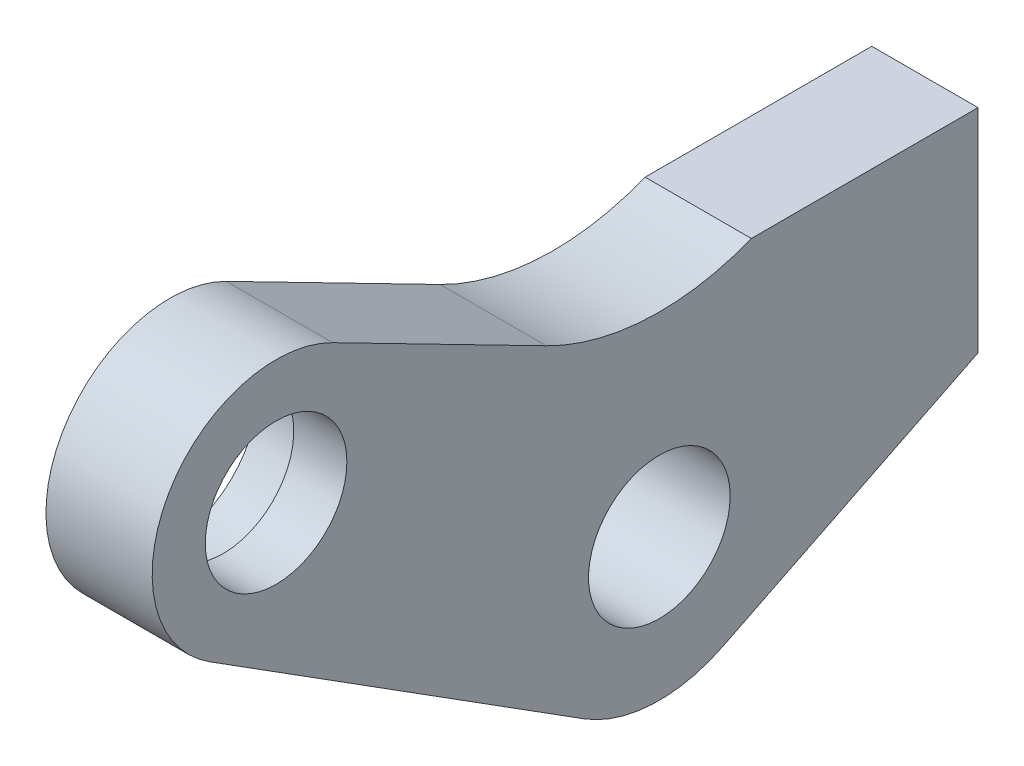
ISO-10303-21;
HEADER;
FILE_DESCRIPTION(('STEP AP214'),'2;1');
FILE_NAME('part.step','',(''),(''),'','','');
FILE_SCHEMA(('AUTOMOTIVE_DESIGN { 1 0 10303 214 1 1 1 1 }'));
ENDSEC;
DATA;
#1=APPLICATION_CONTEXT('core data for automotive mechanical design processes');
#2=APPLICATION_PROTOCOL_DEFINITION('international standard','automotive_design',2000,#1);
#3=PRODUCT_CONTEXT('',#1,'mechanical');
#4=PRODUCT('Part','Part','',(#3));
#5=PRODUCT_RELATED_PRODUCT_CATEGORY('part','',(#4));
#6=PRODUCT_DEFINITION_FORMATION('','',#4);
#7=PRODUCT_DEFINITION_CONTEXT('part definition',#1,'design');
#8=PRODUCT_DEFINITION('design','',#6,#7);
#9=PRODUCT_DEFINITION_SHAPE('','',#8);
#10=(LENGTH_UNIT() NAMED_UNIT(*) SI_UNIT(.MILLI.,.METRE.));
#11=(NAMED_UNIT(*) PLANE_ANGLE_UNIT() SI_UNIT($,.RADIAN.));
#12=(NAMED_UNIT(*) SI_UNIT($,.STERADIAN.) SOLID_ANGLE_UNIT());
#13=UNCERTAINTY_MEASURE_WITH_UNIT(LENGTH_MEASURE(1.E-05),#10,'distance_accuracy_value','');
#14=(GEOMETRIC_REPRESENTATION_CONTEXT(3) GLOBAL_UNCERTAINTY_ASSIGNED_CONTEXT((#13)) GLOBAL_UNIT_ASSIGNED_CONTEXT((#10,
#11,#12)) REPRESENTATION_CONTEXT('',''));
#15=CARTESIAN_POINT('',(0.,0.,0.));
#16=DIRECTION('',(0.,0.,1.));
#17=DIRECTION('',(1.,0.,0.));
#18=AXIS2_PLACEMENT_3D('',#15,#16,#17);
#19=CARTESIAN_POINT('',(6.,42.,51.));
#20=DIRECTION('',(-1.,0.,0.));
#21=DIRECTION('',(0.,0.,1.));
#22=AXIS2_PLACEMENT_3D('',#19,#20,#21);
#23=CYLINDRICAL_SURFACE('',#22,4.00000000000001);
#24=CARTESIAN_POINT('',(6.,42.,51.));
#25=DIRECTION('',(1.,0.,0.));
#26=DIRECTION('',(0.,0.,-1.));
#27=AXIS2_PLACEMENT_3D('',#24,#25,#26);
#28=CIRCLE('',#27,4.00000000000001);
#29=CARTESIAN_POINT('',(6.,42.,47.));
#30=VERTEX_POINT('',#29);
#31=EDGE_CURVE('E136',#30,#30,#28,.T.);
#32=ORIENTED_EDGE('',*,*,#31,.T.);
#33=EDGE_LOOP('',(#32));
#34=FACE_BOUND('',#33,.T.);
#35=CARTESIAN_POINT('',(3.,42.,51.));
#36=DIRECTION('',(-1.,0.,0.));
#37=DIRECTION('',(0.,0.,1.));
#38=AXIS2_PLACEMENT_3D('',#35,#36,#37);
#39=CIRCLE('',#38,4.00000000000001);
#40=CARTESIAN_POINT('',(3.,42.,55.));
#41=VERTEX_POINT('',#40);
#42=EDGE_CURVE('E37',#41,#41,#39,.T.);
#43=ORIENTED_EDGE('',*,*,#42,.T.);
#44=EDGE_LOOP('',(#43));
#45=FACE_BOUND('',#44,.T.);
#46=ADVANCED_FACE('F33',(#34,#45),#23,.F.);
#47=CARTESIAN_POINT('',(6.,42.,51.));
#48=DIRECTION('',(-1.,0.,0.));
#49=DIRECTION('',(0.,0.,1.));
#50=AXIS2_PLACEMENT_3D('',#47,#48,#49);
#51=PLANE('',#50);
#52=ORIENTED_EDGE('',*,*,#31,.F.);
#53=EDGE_LOOP('',(#52));
#54=FACE_BOUND('',#53,.T.);
#55=CARTESIAN_POINT('',(6.,42.,51.));
#56=DIRECTION('',(1.,0.,0.));
#57=DIRECTION('',(0.,0.,1.));
#58=AXIS2_PLACEMENT_3D('',#55,#56,#57);
#59=CIRCLE('',#58,6.99999999999999);
#60=CARTESIAN_POINT('',(6.,48.2292552348518,47.8068230210226));
#61=VERTEX_POINT('',#60);
#62=CARTESIAN_POINT('',(6.,36.0826738572205,54.7396859921627));
#63=VERTEX_POINT('',#62);
#64=EDGE_CURVE('E147',#61,#63,#59,.T.);
#65=ORIENTED_EDGE('',*,*,#64,.T.);
#66=DIRECTION('',(0.,-0.534240856023249,-0.845332306111358));
#67=VECTOR('',#66,1.);
#68=CARTESIAN_POINT('',(6.,36.0826738572205,54.7396859921627));
#69=LINE('',#68,#67);
#70=CARTESIAN_POINT('',(6.,22.7373415511092,33.623291753575));
#71=VERTEX_POINT('',#70);
#72=EDGE_CURVE('E94',#63,#71,#69,.T.);
#73=ORIENTED_EDGE('',*,*,#72,.T.);
#74=CARTESIAN_POINT('',(6.,29.5,29.349364905389));
#75=DIRECTION('',(1.,0.,0.));
#76=DIRECTION('',(0.,0.,-1.));
#77=AXIS2_PLACEMENT_3D('',#74,#75,#76);
#78=CIRCLE('',#77,7.99999999999999);
#79=CARTESIAN_POINT('',(6.,22.3335486681791,25.7938093498335));
#80=VERTEX_POINT('',#79);
#81=EDGE_CURVE('E163',#71,#80,#78,.T.);
#82=ORIENTED_EDGE('',*,*,#81,.T.);
#83=DIRECTION('',(0.,0.444444444444444,-0.895806416477617));
#84=VECTOR('',#83,1.);
#85=CARTESIAN_POINT('',(6.,29.5,11.349364905389));
#86=LINE('',#85,#84);
#87=CARTESIAN_POINT('',(6.,29.5,11.349364905389));
#88=VERTEX_POINT('',#87);
#89=EDGE_CURVE('E176',#80,#88,#86,.T.);
#90=ORIENTED_EDGE('',*,*,#89,.T.);
#91=DIRECTION('',(0.,1.,0.));
#92=VECTOR('',#91,1.);
#93=CARTESIAN_POINT('',(6.,41.5,11.349364905389));
#94=LINE('',#93,#92);
#95=CARTESIAN_POINT('',(6.,41.5,11.349364905389));
#96=VERTEX_POINT('',#95);
#97=EDGE_CURVE('E114',#88,#96,#94,.T.);
#98=ORIENTED_EDGE('',*,*,#97,.T.);
#99=DIRECTION('',(0.,0.,1.));
#100=VECTOR('',#99,1.);
#101=CARTESIAN_POINT('',(6.,41.5,11.349364905389));
#102=LINE('',#101,#100);
#103=CARTESIAN_POINT('',(6.,41.5,24.1532124826824));
#104=VERTEX_POINT('',#103);
#105=EDGE_CURVE('E107',#96,#104,#102,.T.);
#106=ORIENTED_EDGE('',*,*,#105,.T.);
#107=CARTESIAN_POINT('',(6.,54.5,29.349364905389));
#108=DIRECTION('',(-1.,0.,0.));
#109=DIRECTION('',(0.,0.,-1.));
#110=AXIS2_PLACEMENT_3D('',#107,#108,#109);
#111=CIRCLE('',#110,14.);
#112=CARTESIAN_POINT('',(6.,42.0414895302964,35.7357188633439));
#113=VERTEX_POINT('',#112);
#114=EDGE_CURVE('E112',#104,#113,#111,.T.);
#115=ORIENTED_EDGE('',*,*,#114,.T.);
#116=DIRECTION('',(0.,0.456168139853917,0.88989360497883));
#117=VECTOR('',#116,1.);
#118=CARTESIAN_POINT('',(6.,48.2292552348518,47.8068230210226));
#119=LINE('',#118,#117);
#120=EDGE_CURVE('E51',#113,#61,#119,.T.);
#121=ORIENTED_EDGE('',*,*,#120,.T.);
#122=EDGE_LOOP('',(#65,#73,#82,#90,#98,#106,#115,#121));
#123=FACE_BOUND('',#122,.T.);
#124=CARTESIAN_POINT('',(6.,29.5,29.349364905389));
#125=DIRECTION('',(1.,0.,0.));
#126=DIRECTION('',(0.,0.,-1.));
#127=AXIS2_PLACEMENT_3D('',#124,#125,#126);
#128=CIRCLE('',#127,4.);
#129=CARTESIAN_POINT('',(6.,29.5,25.349364905389));
#130=VERTEX_POINT('',#129);
#131=EDGE_CURVE('E184',#130,#130,#128,.T.);
#132=ORIENTED_EDGE('',*,*,#131,.F.);
#133=EDGE_LOOP('',(#132));
#134=FACE_BOUND('',#133,.T.);
#135=ADVANCED_FACE('F109',(#54,#123,#134),#51,.F.);
#136=CARTESIAN_POINT('',(0.,42.,51.));
#137=DIRECTION('',(-1.,0.,0.));
#138=DIRECTION('',(0.,0.,1.));
#139=AXIS2_PLACEMENT_3D('',#136,#137,#138);
#140=PLANE('',#139);
#141=CARTESIAN_POINT('',(0.,42.,51.));
#142=DIRECTION('',(-1.,0.,0.));
#143=DIRECTION('',(0.,0.,1.));
#144=AXIS2_PLACEMENT_3D('',#141,#142,#143);
#145=CIRCLE('',#144,4.99);
#146=CARTESIAN_POINT('',(0.,42.,55.99));
#147=VERTEX_POINT('',#146);
#148=EDGE_CURVE('E190',#147,#147,#145,.T.);
#149=ORIENTED_EDGE('',*,*,#148,.F.);
#150=EDGE_LOOP('',(#149));
#151=FACE_BOUND('',#150,.T.);
#152=CARTESIAN_POINT('',(0.,42.,51.));
#153=DIRECTION('',(1.,0.,0.));
#154=DIRECTION('',(0.,0.,1.));
#155=AXIS2_PLACEMENT_3D('',#152,#153,#154);
#156=CIRCLE('',#155,6.99999999999999);
#157=CARTESIAN_POINT('',(0.,48.2292552348518,47.8068230210226));
#158=VERTEX_POINT('',#157);
#159=CARTESIAN_POINT('',(0.,36.0826738572205,54.7396859921627));
#160=VERTEX_POINT('',#159);
#161=EDGE_CURVE('E132',#158,#160,#156,.T.);
#162=ORIENTED_EDGE('',*,*,#161,.F.);
#163=DIRECTION('',(0.,0.456168139853917,0.88989360497883));
#164=VECTOR('',#163,1.);
#165=CARTESIAN_POINT('',(0.,48.2292552348518,47.8068230210226));
#166=LINE('',#165,#164);
#167=CARTESIAN_POINT('',(0.,42.0414895302964,35.7357188633439));
#168=VERTEX_POINT('',#167);
#169=EDGE_CURVE('E86',#168,#158,#166,.T.);
#170=ORIENTED_EDGE('',*,*,#169,.F.);
#171=CARTESIAN_POINT('',(0.,54.5,29.349364905389));
#172=DIRECTION('',(-1.,0.,0.));
#173=DIRECTION('',(0.,0.,-1.));
#174=AXIS2_PLACEMENT_3D('',#171,#172,#173);
#175=CIRCLE('',#174,14.);
#176=CARTESIAN_POINT('',(0.,41.5,24.1532124826824));
#177=VERTEX_POINT('',#176);
#178=EDGE_CURVE('E80',#177,#168,#175,.T.);
#179=ORIENTED_EDGE('',*,*,#178,.F.);
#180=DIRECTION('',(0.,0.,1.));
#181=VECTOR('',#180,1.);
#182=CARTESIAN_POINT('',(0.,41.5,11.349364905389));
#183=LINE('',#182,#181);
#184=CARTESIAN_POINT('',(0.,41.5,11.349364905389));
#185=VERTEX_POINT('',#184);
#186=EDGE_CURVE('E122',#185,#177,#183,.T.);
#187=ORIENTED_EDGE('',*,*,#186,.F.);
#188=DIRECTION('',(0.,1.,0.));
#189=VECTOR('',#188,1.);
#190=CARTESIAN_POINT('',(0.,41.5,11.349364905389));
#191=LINE('',#190,#189);
#192=CARTESIAN_POINT('',(0.,29.5,11.349364905389));
#193=VERTEX_POINT('',#192);
#194=EDGE_CURVE('E142',#193,#185,#191,.T.);
#195=ORIENTED_EDGE('',*,*,#194,.F.);
#196=DIRECTION('',(0.,0.444444444444444,-0.895806416477617));
#197=VECTOR('',#196,1.);
#198=CARTESIAN_POINT('',(0.,29.5,11.349364905389));
#199=LINE('',#198,#197);
#200=CARTESIAN_POINT('',(0.,22.3335486681791,25.7938093498335));
#201=VERTEX_POINT('',#200);
#202=EDGE_CURVE('E140',#201,#193,#199,.T.);
#203=ORIENTED_EDGE('',*,*,#202,.F.);
#204=CARTESIAN_POINT('',(0.,29.5,29.349364905389));
#205=DIRECTION('',(1.,0.,0.));
#206=DIRECTION('',(0.,0.,-1.));
#207=AXIS2_PLACEMENT_3D('',#204,#205,#206);
#208=CIRCLE('',#207,7.99999999999999);
#209=CARTESIAN_POINT('',(0.,22.7373415511092,33.623291753575));
#210=VERTEX_POINT('',#209);
#211=EDGE_CURVE('E138',#210,#201,#208,.T.);
#212=ORIENTED_EDGE('',*,*,#211,.F.);
#213=DIRECTION('',(0.,-0.534240856023249,-0.845332306111358));
#214=VECTOR('',#213,1.);
#215=CARTESIAN_POINT('',(0.,36.0826738572205,54.7396859921627));
#216=LINE('',#215,#214);
#217=EDGE_CURVE('E135',#160,#210,#216,.T.);
#218=ORIENTED_EDGE('',*,*,#217,.F.);
#219=EDGE_LOOP('',(#162,#170,#179,#187,#195,#203,#212,#218));
#220=FACE_BOUND('',#219,.T.);
#221=CARTESIAN_POINT('',(0.,29.5,29.349364905389));
#222=DIRECTION('',(1.,0.,0.));
#223=DIRECTION('',(0.,0.,-1.));
#224=AXIS2_PLACEMENT_3D('',#221,#222,#223);
#225=CIRCLE('',#224,4.);
#226=CARTESIAN_POINT('',(0.,29.5,25.349364905389));
#227=VERTEX_POINT('',#226);
#228=EDGE_CURVE('E185',#227,#227,#225,.T.);
#229=ORIENTED_EDGE('',*,*,#228,.T.);
#230=EDGE_LOOP('',(#229));
#231=FACE_BOUND('',#230,.T.);
#232=ADVANCED_FACE('F167',(#151,#220,#231),#140,.T.);
#233=CARTESIAN_POINT('',(6.,42.,51.));
#234=DIRECTION('',(-1.,0.,0.));
#235=DIRECTION('',(0.,0.,1.));
#236=AXIS2_PLACEMENT_3D('',#233,#234,#235);
#237=CYLINDRICAL_SURFACE('',#236,6.99999999999999);
#238=ORIENTED_EDGE('',*,*,#161,.T.);
#239=DIRECTION('',(-1.,0.,0.));
#240=VECTOR('',#239,1.);
#241=CARTESIAN_POINT('',(6.,36.0826738572205,54.7396859921627));
#242=LINE('',#241,#240);
#243=EDGE_CURVE('E11',#63,#160,#242,.T.);
#244=ORIENTED_EDGE('',*,*,#243,.F.);
#245=ORIENTED_EDGE('',*,*,#64,.F.);
#246=DIRECTION('',(-1.,0.,0.));
#247=VECTOR('',#246,1.);
#248=CARTESIAN_POINT('',(6.,48.2292552348518,47.8068230210226));
#249=LINE('',#248,#247);
#250=EDGE_CURVE('E128',#61,#158,#249,.T.);
#251=ORIENTED_EDGE('',*,*,#250,.T.);
#252=EDGE_LOOP('',(#238,#244,#245,#251));
#253=FACE_BOUND('',#252,.T.);
#254=ADVANCED_FACE('F35',(#253),#237,.T.);
#255=CARTESIAN_POINT('',(6.,36.0826738572205,54.7396859921627));
#256=DIRECTION('',(0.,0.845332306111357,-0.534240856023249));
#257=DIRECTION('',(0.,0.534240856023249,0.845332306111358));
#258=AXIS2_PLACEMENT_3D('',#255,#256,#257);
#259=PLANE('',#258);
#260=ORIENTED_EDGE('',*,*,#217,.T.);
#261=DIRECTION('',(-1.,0.,0.));
#262=VECTOR('',#261,1.);
#263=CARTESIAN_POINT('',(6.,22.7373415511092,33.623291753575));
#264=LINE('',#263,#262);
#265=EDGE_CURVE('E43',#71,#210,#264,.T.);
#266=ORIENTED_EDGE('',*,*,#265,.F.);
#267=ORIENTED_EDGE('',*,*,#72,.F.);
#268=ORIENTED_EDGE('',*,*,#243,.T.);
#269=EDGE_LOOP('',(#260,#266,#267,#268));
#270=FACE_BOUND('',#269,.T.);
#271=ADVANCED_FACE('F237',(#270),#259,.F.);
#272=CARTESIAN_POINT('',(6.,29.5,29.349364905389));
#273=DIRECTION('',(-1.,0.,0.));
#274=DIRECTION('',(0.,0.,1.));
#275=AXIS2_PLACEMENT_3D('',#272,#273,#274);
#276=CYLINDRICAL_SURFACE('',#275,7.99999999999999);
#277=ORIENTED_EDGE('',*,*,#211,.T.);
#278=DIRECTION('',(-1.,0.,0.));
#279=VECTOR('',#278,1.);
#280=CARTESIAN_POINT('',(6.,22.3335486681791,25.7938093498335));
#281=LINE('',#280,#279);
#282=EDGE_CURVE('E154',#80,#201,#281,.T.);
#283=ORIENTED_EDGE('',*,*,#282,.F.);
#284=ORIENTED_EDGE('',*,*,#81,.F.);
#285=ORIENTED_EDGE('',*,*,#265,.T.);
#286=EDGE_LOOP('',(#277,#283,#284,#285));
#287=FACE_BOUND('',#286,.T.);
#288=ADVANCED_FACE('F161',(#287),#276,.T.);
#289=CARTESIAN_POINT('',(6.,29.5,11.349364905389));
#290=DIRECTION('',(0.,0.895806416477617,0.444444444444444));
#291=DIRECTION('',(0.,-0.444444444444444,0.895806416477617));
#292=AXIS2_PLACEMENT_3D('',#289,#290,#291);
#293=PLANE('',#292);
#294=ORIENTED_EDGE('',*,*,#202,.T.);
#295=DIRECTION('',(-1.,0.,0.));
#296=VECTOR('',#295,1.);
#297=CARTESIAN_POINT('',(6.,29.5,11.349364905389));
#298=LINE('',#297,#296);
#299=EDGE_CURVE('E151',#88,#193,#298,.T.);
#300=ORIENTED_EDGE('',*,*,#299,.F.);
#301=ORIENTED_EDGE('',*,*,#89,.F.);
#302=ORIENTED_EDGE('',*,*,#282,.T.);
#303=EDGE_LOOP('',(#294,#300,#301,#302));
#304=FACE_BOUND('',#303,.T.);
#305=ADVANCED_FACE('F172',(#304),#293,.F.);
#306=CARTESIAN_POINT('',(6.,41.5,11.349364905389));
#307=DIRECTION('',(0.,0.,1.));
#308=DIRECTION('',(1.,0.,0.));
#309=AXIS2_PLACEMENT_3D('',#306,#307,#308);
#310=PLANE('',#309);
#311=ORIENTED_EDGE('',*,*,#194,.T.);
#312=DIRECTION('',(-1.,0.,0.));
#313=VECTOR('',#312,1.);
#314=CARTESIAN_POINT('',(6.,41.5,11.349364905389));
#315=LINE('',#314,#313);
#316=EDGE_CURVE('E123',#96,#185,#315,.T.);
#317=ORIENTED_EDGE('',*,*,#316,.F.);
#318=ORIENTED_EDGE('',*,*,#97,.F.);
#319=ORIENTED_EDGE('',*,*,#299,.T.);
#320=EDGE_LOOP('',(#311,#317,#318,#319));
#321=FACE_BOUND('',#320,.T.);
#322=ADVANCED_FACE('F175',(#321),#310,.F.);
#323=CARTESIAN_POINT('',(6.,41.5,11.349364905389));
#324=DIRECTION('',(0.,-1.,0.));
#325=DIRECTION('',(0.,0.,-1.));
#326=AXIS2_PLACEMENT_3D('',#323,#324,#325);
#327=PLANE('',#326);
#328=ORIENTED_EDGE('',*,*,#186,.T.);
#329=DIRECTION('',(-1.,0.,0.));
#330=VECTOR('',#329,1.);
#331=CARTESIAN_POINT('',(6.,41.5,24.1532124826824));
#332=LINE('',#331,#330);
#333=EDGE_CURVE('E119',#104,#177,#332,.T.);
#334=ORIENTED_EDGE('',*,*,#333,.F.);
#335=ORIENTED_EDGE('',*,*,#105,.F.);
#336=ORIENTED_EDGE('',*,*,#316,.T.);
#337=EDGE_LOOP('',(#328,#334,#335,#336));
#338=FACE_BOUND('',#337,.T.);
#339=ADVANCED_FACE('F120',(#338),#327,.F.);
#340=CARTESIAN_POINT('',(6.,54.5,29.349364905389));
#341=DIRECTION('',(-1.,0.,0.));
#342=DIRECTION('',(0.,0.,1.));
#343=AXIS2_PLACEMENT_3D('',#340,#341,#342);
#344=CYLINDRICAL_SURFACE('',#343,14.);
#345=ORIENTED_EDGE('',*,*,#178,.T.);
#346=DIRECTION('',(-1.,0.,0.));
#347=VECTOR('',#346,1.);
#348=CARTESIAN_POINT('',(6.,42.0414895302964,35.7357188633439));
#349=LINE('',#348,#347);
#350=EDGE_CURVE('E124',#113,#168,#349,.T.);
#351=ORIENTED_EDGE('',*,*,#350,.F.);
#352=ORIENTED_EDGE('',*,*,#114,.F.);
#353=ORIENTED_EDGE('',*,*,#333,.T.);
#354=EDGE_LOOP('',(#345,#351,#352,#353));
#355=FACE_BOUND('',#354,.T.);
#356=ADVANCED_FACE('F126',(#355),#344,.F.);
#357=CARTESIAN_POINT('',(6.,48.2292552348518,47.8068230210226));
#358=DIRECTION('',(0.,-0.88989360497883,0.456168139853917));
#359=DIRECTION('',(0.,-0.456168139853917,-0.88989360497883));
#360=AXIS2_PLACEMENT_3D('',#357,#358,#359);
#361=PLANE('',#360);
#362=ORIENTED_EDGE('',*,*,#169,.T.);
#363=ORIENTED_EDGE('',*,*,#250,.F.);
#364=ORIENTED_EDGE('',*,*,#120,.F.);
#365=ORIENTED_EDGE('',*,*,#350,.T.);
#366=EDGE_LOOP('',(#362,#363,#364,#365));
#367=FACE_BOUND('',#366,.T.);
#368=ADVANCED_FACE('F225',(#367),#361,.F.);
#369=CARTESIAN_POINT('',(6.,29.5,29.349364905389));
#370=DIRECTION('',(-1.,0.,0.));
#371=DIRECTION('',(0.,0.,1.));
#372=AXIS2_PLACEMENT_3D('',#369,#370,#371);
#373=CYLINDRICAL_SURFACE('',#372,4.);
#374=ORIENTED_EDGE('',*,*,#131,.T.);
#375=EDGE_LOOP('',(#374));
#376=FACE_BOUND('',#375,.T.);
#377=ORIENTED_EDGE('',*,*,#228,.F.);
#378=EDGE_LOOP('',(#377));
#379=FACE_BOUND('',#378,.T.);
#380=ADVANCED_FACE('F208',(#376,#379),#373,.F.);
#381=CARTESIAN_POINT('',(3.,42.,51.));
#382=DIRECTION('',(-1.,0.,0.));
#383=DIRECTION('',(0.,0.,1.));
#384=AXIS2_PLACEMENT_3D('',#381,#382,#383);
#385=CYLINDRICAL_SURFACE('',#384,4.99);
#386=CARTESIAN_POINT('',(3.,42.,51.));
#387=DIRECTION('',(-1.,0.,0.));
#388=DIRECTION('',(0.,0.,1.));
#389=AXIS2_PLACEMENT_3D('',#386,#387,#388);
#390=CIRCLE('',#389,4.99);
#391=CARTESIAN_POINT('',(3.,42.,55.99));
#392=VERTEX_POINT('',#391);
#393=EDGE_CURVE('E193',#392,#392,#390,.T.);
#394=ORIENTED_EDGE('',*,*,#393,.F.);
#395=EDGE_LOOP('',(#394));
#396=FACE_BOUND('',#395,.T.);
#397=ORIENTED_EDGE('',*,*,#148,.T.);
#398=EDGE_LOOP('',(#397));
#399=FACE_BOUND('',#398,.T.);
#400=ADVANCED_FACE('F203',(#396,#399),#385,.F.);
#401=CARTESIAN_POINT('',(3.,42.,51.));
#402=DIRECTION('',(-1.,0.,0.));
#403=DIRECTION('',(0.,0.,1.));
#404=AXIS2_PLACEMENT_3D('',#401,#402,#403);
#405=PLANE('',#404);
#406=ORIENTED_EDGE('',*,*,#42,.F.);
#407=EDGE_LOOP('',(#406));
#408=FACE_BOUND('',#407,.T.);
#409=ORIENTED_EDGE('',*,*,#393,.T.);
#410=EDGE_LOOP('',(#409));
#411=FACE_BOUND('',#410,.T.);
#412=ADVANCED_FACE('F201',(#408,#411),#405,.T.);
#413=CLOSED_SHELL('',(#46,#135,#232,#254,#271,#288,#305,#322,#339,#356,#368,#380,#400,#412));
#414=MANIFOLD_SOLID_BREP('B2',#413);
#415=ADVANCED_BREP_SHAPE_REPRESENTATION('',(#18,#414),#14);
#416=SHAPE_DEFINITION_REPRESENTATION(#9,#415);
ENDSEC;
END-ISO-10303-21;
